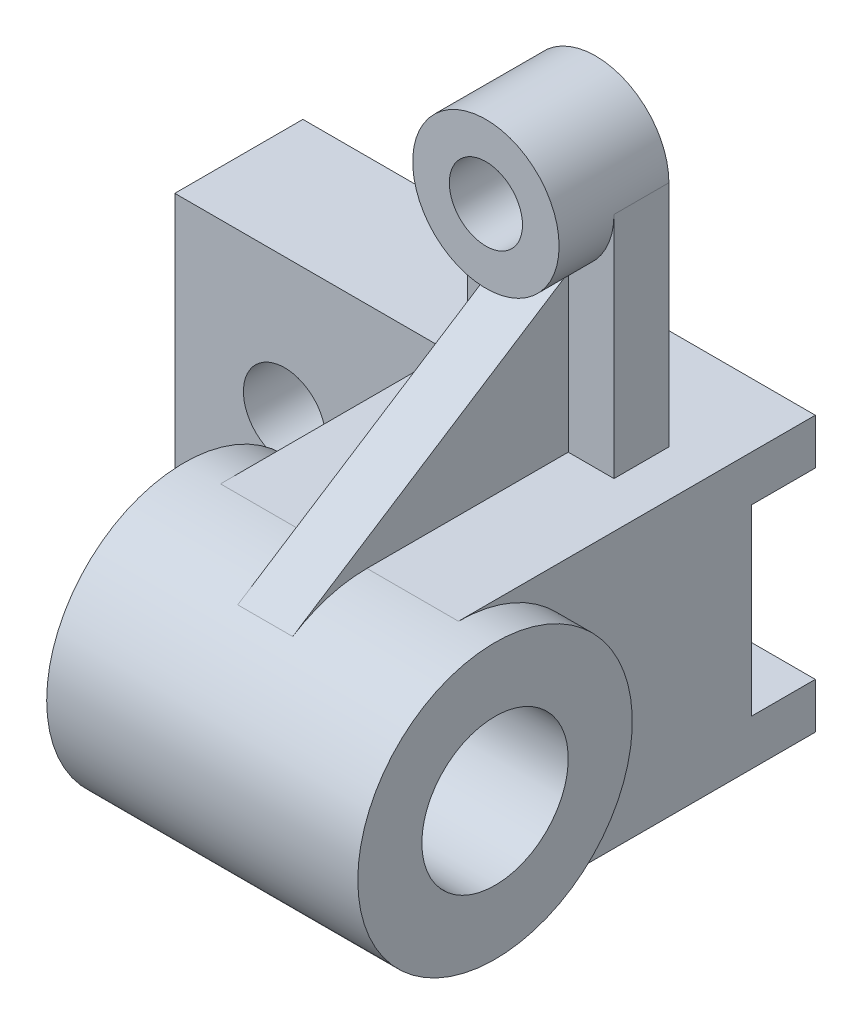
ISO-10303-21;
HEADER;
FILE_DESCRIPTION(('STEP AP214'),'2;1');
FILE_NAME('part.step','',(''),(''),'','','');
FILE_SCHEMA(('AUTOMOTIVE_DESIGN { 1 0 10303 214 1 1 1 1 }'));
ENDSEC;
DATA;
#1=APPLICATION_CONTEXT('core data for automotive mechanical design processes');
#2=APPLICATION_PROTOCOL_DEFINITION('international standard','automotive_design',2000,#1);
#3=PRODUCT_CONTEXT('',#1,'mechanical');
#4=PRODUCT('Part','Part','',(#3));
#5=PRODUCT_RELATED_PRODUCT_CATEGORY('part','',(#4));
#6=PRODUCT_DEFINITION_FORMATION('','',#4);
#7=PRODUCT_DEFINITION_CONTEXT('part definition',#1,'design');
#8=PRODUCT_DEFINITION('design','',#6,#7);
#9=PRODUCT_DEFINITION_SHAPE('','',#8);
#10=(LENGTH_UNIT() NAMED_UNIT(*) SI_UNIT(.MILLI.,.METRE.));
#11=(NAMED_UNIT(*) PLANE_ANGLE_UNIT() SI_UNIT($,.RADIAN.));
#12=(NAMED_UNIT(*) SI_UNIT($,.STERADIAN.) SOLID_ANGLE_UNIT());
#13=UNCERTAINTY_MEASURE_WITH_UNIT(LENGTH_MEASURE(1.E-05),#10,'distance_accuracy_value','');
#14=(GEOMETRIC_REPRESENTATION_CONTEXT(3) GLOBAL_UNCERTAINTY_ASSIGNED_CONTEXT((#13)) GLOBAL_UNIT_ASSIGNED_CONTEXT((#10,
#11,#12)) REPRESENTATION_CONTEXT('',''));
#15=CARTESIAN_POINT('',(0.,0.,0.));
#16=DIRECTION('',(0.,0.,1.));
#17=DIRECTION('',(1.,0.,0.));
#18=AXIS2_PLACEMENT_3D('',#15,#16,#17);
#19=CARTESIAN_POINT('',(46.,80.,6.));
#20=DIRECTION('',(0.,0.,-1.));
#21=DIRECTION('',(-1.,0.,0.));
#22=AXIS2_PLACEMENT_3D('',#19,#20,#21);
#23=PLANE('',#22);
#24=DIRECTION('',(1.,0.,0.));
#25=VECTOR('',#24,1.);
#26=CARTESIAN_POINT('',(46.,64.,6.));
#27=LINE('',#26,#25);
#28=CARTESIAN_POINT('',(30.,64.,6.));
#29=VERTEX_POINT('',#28);
#30=CARTESIAN_POINT('',(36.,64.,6.));
#31=VERTEX_POINT('',#30);
#32=EDGE_CURVE('E630',#29,#31,#27,.T.);
#33=ORIENTED_EDGE('',*,*,#32,.T.);
#34=DIRECTION('',(0.,-1.,0.));
#35=VECTOR('',#34,1.);
#36=CARTESIAN_POINT('',(36.,80.,6.));
#37=LINE('',#36,#35);
#38=CARTESIAN_POINT('',(36.,30.,6.));
#39=VERTEX_POINT('',#38);
#40=EDGE_CURVE('E200',#31,#39,#37,.T.);
#41=ORIENTED_EDGE('',*,*,#40,.T.);
#42=DIRECTION('',(1.,0.,0.));
#43=VECTOR('',#42,1.);
#44=CARTESIAN_POINT('',(46.,30.,6.));
#45=LINE('',#44,#43);
#46=CARTESIAN_POINT('',(46.,30.,6.));
#47=VERTEX_POINT('',#46);
#48=EDGE_CURVE('E179',#39,#47,#45,.T.);
#49=ORIENTED_EDGE('',*,*,#48,.T.);
#50=DIRECTION('',(0.,-1.,0.));
#51=VECTOR('',#50,1.);
#52=CARTESIAN_POINT('',(46.,80.,6.));
#53=LINE('',#52,#51);
#54=CARTESIAN_POINT('',(46.,80.,6.));
#55=VERTEX_POINT('',#54);
#56=EDGE_CURVE('E236',#55,#47,#53,.T.);
#57=ORIENTED_EDGE('',*,*,#56,.F.);
#58=CARTESIAN_POINT('',(30.,80.,6.));
#59=DIRECTION('',(0.,0.,-1.));
#60=DIRECTION('',(-1.,0.,0.));
#61=AXIS2_PLACEMENT_3D('',#58,#59,#60);
#62=CIRCLE('',#61,16.);
#63=EDGE_CURVE('E215',#29,#55,#62,.F.);
#64=ORIENTED_EDGE('',*,*,#63,.F.);
#65=EDGE_LOOP('',(#33,#41,#49,#57,#64));
#66=FACE_BOUND('',#65,.T.);
#67=ADVANCED_FACE('F39',(#66),#23,.F.);
#68=CARTESIAN_POINT('',(-56.,30.,-28.));
#69=DIRECTION('',(0.,1.,0.));
#70=DIRECTION('',(0.,0.,1.));
#71=AXIS2_PLACEMENT_3D('',#68,#69,#70);
#72=PLANE('',#71);
#73=DIRECTION('',(0.,0.,-1.));
#74=VECTOR('',#73,1.);
#75=CARTESIAN_POINT('',(36.,30.,-28.));
#76=LINE('',#75,#74);
#77=CARTESIAN_POINT('',(36.,30.,50.));
#78=VERTEX_POINT('',#77);
#79=EDGE_CURVE('E195',#78,#39,#76,.T.);
#80=ORIENTED_EDGE('',*,*,#79,.F.);
#81=DIRECTION('',(-1.,0.,0.));
#82=VECTOR('',#81,1.);
#83=CARTESIAN_POINT('',(56.,30.,50.));
#84=LINE('',#83,#82);
#85=CARTESIAN_POINT('',(56.,30.,50.));
#86=VERTEX_POINT('',#85);
#87=EDGE_CURVE('E259',#86,#78,#84,.T.);
#88=ORIENTED_EDGE('',*,*,#87,.F.);
#89=DIRECTION('',(0.,0.,1.));
#90=VECTOR('',#89,1.);
#91=CARTESIAN_POINT('',(56.,30.,-28.));
#92=LINE('',#91,#90);
#93=CARTESIAN_POINT('',(56.,30.,-28.));
#94=VERTEX_POINT('',#93);
#95=EDGE_CURVE('E310',#94,#86,#92,.T.);
#96=ORIENTED_EDGE('',*,*,#95,.F.);
#97=DIRECTION('',(-1.,0.,0.));
#98=VECTOR('',#97,1.);
#99=CARTESIAN_POINT('',(-56.,30.,-28.));
#100=LINE('',#99,#98);
#101=CARTESIAN_POINT('',(-56.,30.,-28.));
#102=VERTEX_POINT('',#101);
#103=EDGE_CURVE('E301',#94,#102,#100,.T.);
#104=ORIENTED_EDGE('',*,*,#103,.T.);
#105=DIRECTION('',(0.,0.,1.));
#106=VECTOR('',#105,1.);
#107=CARTESIAN_POINT('',(-56.,30.,-28.));
#108=LINE('',#107,#106);
#109=CARTESIAN_POINT('',(-56.,30.,0.));
#110=VERTEX_POINT('',#109);
#111=EDGE_CURVE('E318',#102,#110,#108,.T.);
#112=ORIENTED_EDGE('',*,*,#111,.T.);
#113=DIRECTION('',(-1.,0.,0.));
#114=VECTOR('',#113,1.);
#115=CARTESIAN_POINT('',(-56.,30.,0.));
#116=LINE('',#115,#114);
#117=CARTESIAN_POINT('',(4.00000000000002,30.,0.));
#118=VERTEX_POINT('',#117);
#119=EDGE_CURVE('E292',#118,#110,#116,.T.);
#120=ORIENTED_EDGE('',*,*,#119,.F.);
#121=DIRECTION('',(0.,0.,-1.));
#122=VECTOR('',#121,1.);
#123=CARTESIAN_POINT('',(4.00000000000002,30.,50.));
#124=LINE('',#123,#122);
#125=CARTESIAN_POINT('',(4.00000000000002,30.,50.));
#126=VERTEX_POINT('',#125);
#127=EDGE_CURVE('E268',#126,#118,#124,.T.);
#128=ORIENTED_EDGE('',*,*,#127,.F.);
#129=CARTESIAN_POINT('',(24.,30.,50.));
#130=VERTEX_POINT('',#129);
#131=EDGE_CURVE('E186',#130,#126,#84,.T.);
#132=ORIENTED_EDGE('',*,*,#131,.F.);
#133=DIRECTION('',(0.,0.,-1.));
#134=VECTOR('',#133,1.);
#135=CARTESIAN_POINT('',(24.,30.,-28.));
#136=LINE('',#135,#134);
#137=CARTESIAN_POINT('',(24.,30.,6.));
#138=VERTEX_POINT('',#137);
#139=EDGE_CURVE('E183',#130,#138,#136,.T.);
#140=ORIENTED_EDGE('',*,*,#139,.T.);
#141=CARTESIAN_POINT('',(14.,30.,6.));
#142=VERTEX_POINT('',#141);
#143=EDGE_CURVE('E167',#142,#138,#45,.T.);
#144=ORIENTED_EDGE('',*,*,#143,.F.);
#145=DIRECTION('',(0.,0.,1.));
#146=VECTOR('',#145,1.);
#147=CARTESIAN_POINT('',(14.,30.,-6.));
#148=LINE('',#147,#146);
#149=CARTESIAN_POINT('',(14.,30.,-6.));
#150=VERTEX_POINT('',#149);
#151=EDGE_CURVE('E219',#150,#142,#148,.T.);
#152=ORIENTED_EDGE('',*,*,#151,.F.);
#153=DIRECTION('',(-1.,0.,0.));
#154=VECTOR('',#153,1.);
#155=CARTESIAN_POINT('',(46.,30.,-6.));
#156=LINE('',#155,#154);
#157=CARTESIAN_POINT('',(46.,30.,-6.));
#158=VERTEX_POINT('',#157);
#159=EDGE_CURVE('E224',#158,#150,#156,.T.);
#160=ORIENTED_EDGE('',*,*,#159,.F.);
#161=DIRECTION('',(0.,0.,-1.));
#162=VECTOR('',#161,1.);
#163=CARTESIAN_POINT('',(46.,30.,-6.));
#164=LINE('',#163,#162);
#165=EDGE_CURVE('E178',#47,#158,#164,.T.);
#166=ORIENTED_EDGE('',*,*,#165,.F.);
#167=ORIENTED_EDGE('',*,*,#48,.F.);
#168=EDGE_LOOP('',(#80,#88,#96,#104,#112,#120,#128,#132,#140,#144,#152,#160,#166,#167));
#169=FACE_BOUND('',#168,.T.);
#170=ADVANCED_FACE('F184',(#169),#72,.T.);
#171=CARTESIAN_POINT('',(0.,0.,0.));
#172=DIRECTION('',(0.,0.,-1.));
#173=DIRECTION('',(-1.,0.,0.));
#174=AXIS2_PLACEMENT_3D('',#171,#172,#173);
#175=PLANE('',#174);
#176=CARTESIAN_POINT('',(-32.,0.,0.));
#177=DIRECTION('',(0.,0.,1.));
#178=DIRECTION('',(1.,0.,0.));
#179=AXIS2_PLACEMENT_3D('',#176,#177,#178);
#180=CIRCLE('',#179,9.);
#181=CARTESIAN_POINT('',(-23.,0.,0.));
#182=VERTEX_POINT('',#181);
#183=EDGE_CURVE('E622',#182,#182,#180,.T.);
#184=ORIENTED_EDGE('',*,*,#183,.F.);
#185=EDGE_LOOP('',(#184));
#186=FACE_BOUND('',#185,.T.);
#187=DIRECTION('',(0.,-1.,0.));
#188=VECTOR('',#187,1.);
#189=CARTESIAN_POINT('',(4.00000000000002,-30.,0.));
#190=LINE('',#189,#188);
#191=CARTESIAN_POINT('',(4.00000000000002,-30.,0.));
#192=VERTEX_POINT('',#191);
#193=EDGE_CURVE('E258',#118,#192,#190,.T.);
#194=ORIENTED_EDGE('',*,*,#193,.F.);
#195=ORIENTED_EDGE('',*,*,#119,.T.);
#196=DIRECTION('',(0.,-1.,0.));
#197=VECTOR('',#196,1.);
#198=CARTESIAN_POINT('',(-56.,-30.,0.));
#199=LINE('',#198,#197);
#200=CARTESIAN_POINT('',(-56.,-30.,0.));
#201=VERTEX_POINT('',#200);
#202=EDGE_CURVE('E312',#110,#201,#199,.T.);
#203=ORIENTED_EDGE('',*,*,#202,.T.);
#204=DIRECTION('',(1.,0.,0.));
#205=VECTOR('',#204,1.);
#206=CARTESIAN_POINT('',(-56.,-30.,0.));
#207=LINE('',#206,#205);
#208=EDGE_CURVE('E315',#201,#192,#207,.T.);
#209=ORIENTED_EDGE('',*,*,#208,.T.);
#210=EDGE_LOOP('',(#194,#195,#203,#209));
#211=FACE_BOUND('',#210,.T.);
#212=ADVANCED_FACE('F364',(#186,#211),#175,.F.);
#213=CARTESIAN_POINT('',(0.,0.,-28.));
#214=DIRECTION('',(0.,0.,-1.));
#215=DIRECTION('',(-1.,0.,0.));
#216=AXIS2_PLACEMENT_3D('',#213,#214,#215);
#217=PLANE('',#216);
#218=DIRECTION('',(0.,1.,0.));
#219=VECTOR('',#218,1.);
#220=CARTESIAN_POINT('',(56.,-30.,-28.));
#221=LINE('',#220,#219);
#222=CARTESIAN_POINT('',(56.,-30.,-28.));
#223=VERTEX_POINT('',#222);
#224=CARTESIAN_POINT('',(56.,-20.,-28.));
#225=VERTEX_POINT('',#224);
#226=EDGE_CURVE('E298',#223,#225,#221,.T.);
#227=ORIENTED_EDGE('',*,*,#226,.F.);
#228=DIRECTION('',(1.,0.,0.));
#229=VECTOR('',#228,1.);
#230=CARTESIAN_POINT('',(-56.,-30.,-28.));
#231=LINE('',#230,#229);
#232=CARTESIAN_POINT('',(-56.,-30.,-28.));
#233=VERTEX_POINT('',#232);
#234=EDGE_CURVE('E308',#233,#223,#231,.T.);
#235=ORIENTED_EDGE('',*,*,#234,.F.);
#236=DIRECTION('',(0.,-1.,0.));
#237=VECTOR('',#236,1.);
#238=CARTESIAN_POINT('',(-56.,-30.,-28.));
#239=LINE('',#238,#237);
#240=CARTESIAN_POINT('',(-56.,-20.,-28.));
#241=VERTEX_POINT('',#240);
#242=EDGE_CURVE('E304',#241,#233,#239,.T.);
#243=ORIENTED_EDGE('',*,*,#242,.F.);
#244=DIRECTION('',(1.,0.,0.));
#245=VECTOR('',#244,1.);
#246=CARTESIAN_POINT('',(-56.,-20.,-28.));
#247=LINE('',#246,#245);
#248=EDGE_CURVE('E290',#241,#225,#247,.T.);
#249=ORIENTED_EDGE('',*,*,#248,.T.);
#250=EDGE_LOOP('',(#227,#235,#243,#249));
#251=FACE_BOUND('',#250,.T.);
#252=ADVANCED_FACE('F341',(#251),#217,.T.);
#253=CARTESIAN_POINT('',(56.,-30.,-28.));
#254=DIRECTION('',(1.,0.,0.));
#255=DIRECTION('',(0.,0.,-1.));
#256=AXIS2_PLACEMENT_3D('',#253,#254,#255);
#257=PLANE('',#256);
#258=ORIENTED_EDGE('',*,*,#95,.T.);
#259=CARTESIAN_POINT('',(56.,0.,50.));
#260=DIRECTION('',(1.,0.,0.));
#261=DIRECTION('',(0.,0.,-1.));
#262=AXIS2_PLACEMENT_3D('',#259,#260,#261);
#263=CIRCLE('',#262,30.);
#264=CARTESIAN_POINT('',(56.,-30.,50.));
#265=VERTEX_POINT('',#264);
#266=EDGE_CURVE('E255',#86,#265,#263,.F.);
#267=ORIENTED_EDGE('',*,*,#266,.T.);
#268=DIRECTION('',(0.,0.,1.));
#269=VECTOR('',#268,1.);
#270=CARTESIAN_POINT('',(56.,-30.,-28.));
#271=LINE('',#270,#269);
#272=EDGE_CURVE('E11',#223,#265,#271,.T.);
#273=ORIENTED_EDGE('',*,*,#272,.F.);
#274=ORIENTED_EDGE('',*,*,#226,.T.);
#275=DIRECTION('',(0.,0.,-1.));
#276=VECTOR('',#275,1.);
#277=CARTESIAN_POINT('',(56.,-20.,-28.));
#278=LINE('',#277,#276);
#279=CARTESIAN_POINT('',(56.,-20.,-14.));
#280=VERTEX_POINT('',#279);
#281=EDGE_CURVE('E276',#280,#225,#278,.T.);
#282=ORIENTED_EDGE('',*,*,#281,.F.);
#283=DIRECTION('',(0.,-1.,0.));
#284=VECTOR('',#283,1.);
#285=CARTESIAN_POINT('',(56.,-20.,-14.));
#286=LINE('',#285,#284);
#287=CARTESIAN_POINT('',(56.,20.,-14.));
#288=VERTEX_POINT('',#287);
#289=EDGE_CURVE('E285',#288,#280,#286,.T.);
#290=ORIENTED_EDGE('',*,*,#289,.F.);
#291=DIRECTION('',(0.,0.,1.));
#292=VECTOR('',#291,1.);
#293=CARTESIAN_POINT('',(56.,20.,-28.));
#294=LINE('',#293,#292);
#295=CARTESIAN_POINT('',(56.,20.,-28.));
#296=VERTEX_POINT('',#295);
#297=EDGE_CURVE('E271',#296,#288,#294,.T.);
#298=ORIENTED_EDGE('',*,*,#297,.F.);
#299=EDGE_CURVE('E302',#296,#94,#221,.T.);
#300=ORIENTED_EDGE('',*,*,#299,.T.);
#301=EDGE_LOOP('',(#258,#267,#273,#274,#282,#290,#298,#300));
#302=FACE_BOUND('',#301,.T.);
#303=ADVANCED_FACE('F41',(#302),#257,.T.);
#304=CARTESIAN_POINT('',(-56.,-30.,-28.));
#305=DIRECTION('',(0.,-1.,0.));
#306=DIRECTION('',(0.,0.,-1.));
#307=AXIS2_PLACEMENT_3D('',#304,#305,#306);
#308=PLANE('',#307);
#309=ORIENTED_EDGE('',*,*,#272,.T.);
#310=DIRECTION('',(1.,0.,0.));
#311=VECTOR('',#310,1.);
#312=CARTESIAN_POINT('',(56.,-30.,50.));
#313=LINE('',#312,#311);
#314=CARTESIAN_POINT('',(4.00000000000002,-30.,50.));
#315=VERTEX_POINT('',#314);
#316=EDGE_CURVE('E261',#315,#265,#313,.T.);
#317=ORIENTED_EDGE('',*,*,#316,.F.);
#318=DIRECTION('',(0.,0.,-1.));
#319=VECTOR('',#318,1.);
#320=CARTESIAN_POINT('',(4.00000000000002,-30.,50.));
#321=LINE('',#320,#319);
#322=EDGE_CURVE('E263',#315,#192,#321,.T.);
#323=ORIENTED_EDGE('',*,*,#322,.T.);
#324=ORIENTED_EDGE('',*,*,#208,.F.);
#325=DIRECTION('',(0.,0.,1.));
#326=VECTOR('',#325,1.);
#327=CARTESIAN_POINT('',(-56.,-30.,-28.));
#328=LINE('',#327,#326);
#329=EDGE_CURVE('E48',#233,#201,#328,.T.);
#330=ORIENTED_EDGE('',*,*,#329,.F.);
#331=ORIENTED_EDGE('',*,*,#234,.T.);
#332=EDGE_LOOP('',(#309,#317,#323,#324,#330,#331));
#333=FACE_BOUND('',#332,.T.);
#334=ADVANCED_FACE('F334',(#333),#308,.T.);
#335=CARTESIAN_POINT('',(-56.,-30.,-28.));
#336=DIRECTION('',(-1.,0.,0.));
#337=DIRECTION('',(0.,0.,1.));
#338=AXIS2_PLACEMENT_3D('',#335,#336,#337);
#339=PLANE('',#338);
#340=DIRECTION('',(0.,0.,-1.));
#341=VECTOR('',#340,1.);
#342=CARTESIAN_POINT('',(-56.,-20.,-28.));
#343=LINE('',#342,#341);
#344=CARTESIAN_POINT('',(-56.,-20.,-14.));
#345=VERTEX_POINT('',#344);
#346=EDGE_CURVE('E279',#345,#241,#343,.T.);
#347=ORIENTED_EDGE('',*,*,#346,.T.);
#348=ORIENTED_EDGE('',*,*,#242,.T.);
#349=ORIENTED_EDGE('',*,*,#329,.T.);
#350=ORIENTED_EDGE('',*,*,#202,.F.);
#351=ORIENTED_EDGE('',*,*,#111,.F.);
#352=CARTESIAN_POINT('',(-56.,20.,-28.));
#353=VERTEX_POINT('',#352);
#354=EDGE_CURVE('E305',#102,#353,#239,.T.);
#355=ORIENTED_EDGE('',*,*,#354,.T.);
#356=DIRECTION('',(0.,0.,1.));
#357=VECTOR('',#356,1.);
#358=CARTESIAN_POINT('',(-56.,20.,-28.));
#359=LINE('',#358,#357);
#360=CARTESIAN_POINT('',(-56.,20.,-14.));
#361=VERTEX_POINT('',#360);
#362=EDGE_CURVE('E272',#353,#361,#359,.T.);
#363=ORIENTED_EDGE('',*,*,#362,.T.);
#364=DIRECTION('',(0.,-1.,0.));
#365=VECTOR('',#364,1.);
#366=CARTESIAN_POINT('',(-56.,-20.,-14.));
#367=LINE('',#366,#365);
#368=EDGE_CURVE('E275',#361,#345,#367,.T.);
#369=ORIENTED_EDGE('',*,*,#368,.T.);
#370=EDGE_LOOP('',(#347,#348,#349,#350,#351,#355,#363,#369));
#371=FACE_BOUND('',#370,.T.);
#372=ADVANCED_FACE('F358',(#371),#339,.T.);
#373=ORIENTED_EDGE('',*,*,#299,.F.);
#374=DIRECTION('',(1.,0.,0.));
#375=VECTOR('',#374,1.);
#376=CARTESIAN_POINT('',(-56.,20.,-28.));
#377=LINE('',#376,#375);
#378=EDGE_CURVE('E282',#353,#296,#377,.T.);
#379=ORIENTED_EDGE('',*,*,#378,.F.);
#380=ORIENTED_EDGE('',*,*,#354,.F.);
#381=ORIENTED_EDGE('',*,*,#103,.F.);
#382=EDGE_LOOP('',(#373,#379,#380,#381));
#383=FACE_BOUND('',#382,.T.);
#384=ADVANCED_FACE('F355',(#383),#217,.T.);
#385=CARTESIAN_POINT('',(-56.,-20.,-28.));
#386=DIRECTION('',(0.,-1.,0.));
#387=DIRECTION('',(0.,0.,-1.));
#388=AXIS2_PLACEMENT_3D('',#385,#386,#387);
#389=PLANE('',#388);
#390=ORIENTED_EDGE('',*,*,#281,.T.);
#391=ORIENTED_EDGE('',*,*,#248,.F.);
#392=ORIENTED_EDGE('',*,*,#346,.F.);
#393=DIRECTION('',(1.,0.,0.));
#394=VECTOR('',#393,1.);
#395=CARTESIAN_POINT('',(-56.,-20.,-14.));
#396=LINE('',#395,#394);
#397=EDGE_CURVE('E293',#345,#280,#396,.T.);
#398=ORIENTED_EDGE('',*,*,#397,.T.);
#399=EDGE_LOOP('',(#390,#391,#392,#398));
#400=FACE_BOUND('',#399,.T.);
#401=ADVANCED_FACE('F345',(#400),#389,.F.);
#402=CARTESIAN_POINT('',(-56.,-20.,-14.));
#403=DIRECTION('',(0.,0.,1.));
#404=DIRECTION('',(0.,-1.,0.));
#405=AXIS2_PLACEMENT_3D('',#402,#403,#404);
#406=PLANE('',#405);
#407=CARTESIAN_POINT('',(-32.,0.,-14.));
#408=DIRECTION('',(0.,0.,1.));
#409=DIRECTION('',(0.,-1.,0.));
#410=AXIS2_PLACEMENT_3D('',#407,#408,#409);
#411=CIRCLE('',#410,9.);
#412=CARTESIAN_POINT('',(-32.,-9.,-14.));
#413=VERTEX_POINT('',#412);
#414=EDGE_CURVE('E43',#413,#413,#411,.T.);
#415=ORIENTED_EDGE('',*,*,#414,.T.);
#416=EDGE_LOOP('',(#415));
#417=FACE_BOUND('',#416,.T.);
#418=ORIENTED_EDGE('',*,*,#289,.T.);
#419=ORIENTED_EDGE('',*,*,#397,.F.);
#420=ORIENTED_EDGE('',*,*,#368,.F.);
#421=DIRECTION('',(1.,0.,0.));
#422=VECTOR('',#421,1.);
#423=CARTESIAN_POINT('',(-56.,20.,-14.));
#424=LINE('',#423,#422);
#425=EDGE_CURVE('E295',#361,#288,#424,.T.);
#426=ORIENTED_EDGE('',*,*,#425,.T.);
#427=EDGE_LOOP('',(#418,#419,#420,#426));
#428=FACE_BOUND('',#427,.T.);
#429=ADVANCED_FACE('F348',(#417,#428),#406,.F.);
#430=CARTESIAN_POINT('',(-56.,20.,-28.));
#431=DIRECTION('',(0.,1.,0.));
#432=DIRECTION('',(0.,0.,1.));
#433=AXIS2_PLACEMENT_3D('',#430,#431,#432);
#434=PLANE('',#433);
#435=ORIENTED_EDGE('',*,*,#297,.T.);
#436=ORIENTED_EDGE('',*,*,#425,.F.);
#437=ORIENTED_EDGE('',*,*,#362,.F.);
#438=ORIENTED_EDGE('',*,*,#378,.T.);
#439=EDGE_LOOP('',(#435,#436,#437,#438));
#440=FACE_BOUND('',#439,.T.);
#441=ADVANCED_FACE('F351',(#440),#434,.F.);
#442=CARTESIAN_POINT('',(4.00000000000002,-30.,50.));
#443=DIRECTION('',(1.,0.,0.));
#444=DIRECTION('',(0.,0.,-1.));
#445=AXIS2_PLACEMENT_3D('',#442,#443,#444);
#446=PLANE('',#445);
#447=CARTESIAN_POINT('',(4.00000000000002,0.,50.));
#448=DIRECTION('',(1.,0.,0.));
#449=DIRECTION('',(0.,0.,-1.));
#450=AXIS2_PLACEMENT_3D('',#447,#448,#449);
#451=CIRCLE('',#450,30.);
#452=EDGE_CURVE('E252',#126,#315,#451,.F.);
#453=ORIENTED_EDGE('',*,*,#452,.F.);
#454=ORIENTED_EDGE('',*,*,#127,.T.);
#455=ORIENTED_EDGE('',*,*,#193,.T.);
#456=ORIENTED_EDGE('',*,*,#322,.F.);
#457=EDGE_LOOP('',(#453,#454,#455,#456));
#458=FACE_BOUND('',#457,.T.);
#459=ADVANCED_FACE('F363',(#458),#446,.F.);
#460=CARTESIAN_POINT('',(-3.99999999999998,0.,50.));
#461=DIRECTION('',(-1.,0.,0.));
#462=DIRECTION('',(0.,0.,1.));
#463=AXIS2_PLACEMENT_3D('',#460,#461,#462);
#464=PLANE('',#463);
#465=CARTESIAN_POINT('',(-3.99999999999998,0.,50.));
#466=DIRECTION('',(-1.,0.,0.));
#467=DIRECTION('',(0.,0.,1.));
#468=AXIS2_PLACEMENT_3D('',#465,#466,#467);
#469=CIRCLE('',#468,30.);
#470=CARTESIAN_POINT('',(-3.99999999999998,0.,80.));
#471=VERTEX_POINT('',#470);
#472=EDGE_CURVE('E249',#471,#471,#469,.T.);
#473=ORIENTED_EDGE('',*,*,#472,.T.);
#474=EDGE_LOOP('',(#473));
#475=FACE_BOUND('',#474,.T.);
#476=CARTESIAN_POINT('',(-3.99999999999998,0.,50.));
#477=DIRECTION('',(-1.,0.,0.));
#478=DIRECTION('',(0.,0.,1.));
#479=AXIS2_PLACEMENT_3D('',#476,#477,#478);
#480=CIRCLE('',#479,16.);
#481=CARTESIAN_POINT('',(-3.99999999999998,0.,66.));
#482=VERTEX_POINT('',#481);
#483=EDGE_CURVE('E246',#482,#482,#480,.T.);
#484=ORIENTED_EDGE('',*,*,#483,.F.);
#485=EDGE_LOOP('',(#484));
#486=FACE_BOUND('',#485,.T.);
#487=ADVANCED_FACE('F407',(#475,#486),#464,.T.);
#488=CARTESIAN_POINT('',(-3.99999999999998,0.,50.));
#489=DIRECTION('',(1.,0.,0.));
#490=DIRECTION('',(0.,0.,-1.));
#491=AXIS2_PLACEMENT_3D('',#488,#489,#490);
#492=CYLINDRICAL_SURFACE('',#491,30.);
#493=CARTESIAN_POINT('',(36.,0.,50.));
#494=DIRECTION('',(1.,0.,0.));
#495=DIRECTION('',(0.,0.,-1.));
#496=AXIS2_PLACEMENT_3D('',#493,#494,#495);
#497=CIRCLE('',#496,30.);
#498=CARTESIAN_POINT('',(36.,25.2258176319068,66.2375529191372));
#499=VERTEX_POINT('',#498);
#500=EDGE_CURVE('E56',#78,#499,#497,.T.);
#501=ORIENTED_EDGE('',*,*,#500,.T.);
#502=DIRECTION('',(1.,0.,0.));
#503=VECTOR('',#502,1.);
#504=CARTESIAN_POINT('',(-3.99999999999998,25.2258176319068,66.2375529191372));
#505=LINE('',#504,#503);
#506=CARTESIAN_POINT('',(24.,25.2258176319068,66.2375529191372));
#507=VERTEX_POINT('',#506);
#508=EDGE_CURVE('E60',#507,#499,#505,.T.);
#509=ORIENTED_EDGE('',*,*,#508,.F.);
#510=CARTESIAN_POINT('',(24.,0.,50.));
#511=DIRECTION('',(1.,0.,0.));
#512=DIRECTION('',(0.,0.,-1.));
#513=AXIS2_PLACEMENT_3D('',#510,#511,#512);
#514=CIRCLE('',#513,30.);
#515=EDGE_CURVE('E188',#130,#507,#514,.T.);
#516=ORIENTED_EDGE('',*,*,#515,.F.);
#517=ORIENTED_EDGE('',*,*,#131,.T.);
#518=ORIENTED_EDGE('',*,*,#452,.T.);
#519=ORIENTED_EDGE('',*,*,#316,.T.);
#520=ORIENTED_EDGE('',*,*,#266,.F.);
#521=ORIENTED_EDGE('',*,*,#87,.T.);
#522=EDGE_LOOP('',(#501,#509,#516,#517,#518,#519,#520,#521));
#523=FACE_BOUND('',#522,.T.);
#524=CARTESIAN_POINT('',(64.,0.,50.));
#525=DIRECTION('',(-1.,0.,0.));
#526=DIRECTION('',(0.,0.,1.));
#527=AXIS2_PLACEMENT_3D('',#524,#525,#526);
#528=CIRCLE('',#527,30.);
#529=CARTESIAN_POINT('',(64.,0.,80.));
#530=VERTEX_POINT('',#529);
#531=EDGE_CURVE('E243',#530,#530,#528,.T.);
#532=ORIENTED_EDGE('',*,*,#531,.T.);
#533=EDGE_LOOP('',(#532));
#534=FACE_BOUND('',#533,.T.);
#535=ORIENTED_EDGE('',*,*,#472,.F.);
#536=EDGE_LOOP('',(#535));
#537=FACE_BOUND('',#536,.T.);
#538=ADVANCED_FACE('F329',(#523,#534,#537),#492,.T.);
#539=CARTESIAN_POINT('',(-3.99999999999998,0.,50.));
#540=DIRECTION('',(1.,0.,0.));
#541=DIRECTION('',(0.,0.,-1.));
#542=AXIS2_PLACEMENT_3D('',#539,#540,#541);
#543=CYLINDRICAL_SURFACE('',#542,16.);
#544=CARTESIAN_POINT('',(64.,0.,50.));
#545=DIRECTION('',(-1.,0.,0.));
#546=DIRECTION('',(0.,0.,1.));
#547=AXIS2_PLACEMENT_3D('',#544,#545,#546);
#548=CIRCLE('',#547,16.);
#549=CARTESIAN_POINT('',(64.,0.,66.));
#550=VERTEX_POINT('',#549);
#551=EDGE_CURVE('E240',#550,#550,#548,.T.);
#552=ORIENTED_EDGE('',*,*,#551,.F.);
#553=EDGE_LOOP('',(#552));
#554=FACE_BOUND('',#553,.T.);
#555=ORIENTED_EDGE('',*,*,#483,.T.);
#556=EDGE_LOOP('',(#555));
#557=FACE_BOUND('',#556,.T.);
#558=ADVANCED_FACE('F401',(#554,#557),#543,.F.);
#559=CARTESIAN_POINT('',(64.,0.,50.));
#560=DIRECTION('',(-1.,0.,0.));
#561=DIRECTION('',(0.,0.,1.));
#562=AXIS2_PLACEMENT_3D('',#559,#560,#561);
#563=PLANE('',#562);
#564=ORIENTED_EDGE('',*,*,#551,.T.);
#565=EDGE_LOOP('',(#564));
#566=FACE_BOUND('',#565,.T.);
#567=ORIENTED_EDGE('',*,*,#531,.F.);
#568=EDGE_LOOP('',(#567));
#569=FACE_BOUND('',#568,.T.);
#570=ADVANCED_FACE('F396',(#566,#569),#563,.F.);
#571=CARTESIAN_POINT('',(14.,80.,-6.));
#572=DIRECTION('',(1.,0.,0.));
#573=DIRECTION('',(0.,0.,-1.));
#574=AXIS2_PLACEMENT_3D('',#571,#572,#573);
#575=PLANE('',#574);
#576=ORIENTED_EDGE('',*,*,#151,.T.);
#577=DIRECTION('',(0.,-1.,0.));
#578=VECTOR('',#577,1.);
#579=CARTESIAN_POINT('',(14.,80.,6.));
#580=LINE('',#579,#578);
#581=CARTESIAN_POINT('',(14.,80.,6.));
#582=VERTEX_POINT('',#581);
#583=EDGE_CURVE('E174',#582,#142,#580,.T.);
#584=ORIENTED_EDGE('',*,*,#583,.F.);
#585=DIRECTION('',(0.,0.,1.));
#586=VECTOR('',#585,1.);
#587=CARTESIAN_POINT('',(14.,80.,-6.));
#588=LINE('',#587,#586);
#589=CARTESIAN_POINT('',(14.,80.,-5.99999999999999));
#590=VERTEX_POINT('',#589);
#591=EDGE_CURVE('E220',#590,#582,#588,.T.);
#592=ORIENTED_EDGE('',*,*,#591,.F.);
#593=DIRECTION('',(0.,-1.,0.));
#594=VECTOR('',#593,1.);
#595=CARTESIAN_POINT('',(14.,80.,-6.));
#596=LINE('',#595,#594);
#597=EDGE_CURVE('E227',#590,#150,#596,.T.);
#598=ORIENTED_EDGE('',*,*,#597,.T.);
#599=EDGE_LOOP('',(#576,#584,#592,#598));
#600=FACE_BOUND('',#599,.T.);
#601=ADVANCED_FACE('F387',(#600),#575,.F.);
#602=DIRECTION('',(0.,-1.,0.));
#603=VECTOR('',#602,1.);
#604=CARTESIAN_POINT('',(24.,80.,6.));
#605=LINE('',#604,#603);
#606=CARTESIAN_POINT('',(24.,64.,6.));
#607=VERTEX_POINT('',#606);
#608=EDGE_CURVE('E171',#607,#138,#605,.T.);
#609=ORIENTED_EDGE('',*,*,#608,.F.);
#610=EDGE_CURVE('E633',#607,#29,#27,.T.);
#611=ORIENTED_EDGE('',*,*,#610,.T.);
#612=EDGE_CURVE('E216',#582,#29,#62,.F.);
#613=ORIENTED_EDGE('',*,*,#612,.F.);
#614=ORIENTED_EDGE('',*,*,#583,.T.);
#615=ORIENTED_EDGE('',*,*,#143,.T.);
#616=EDGE_LOOP('',(#609,#611,#613,#614,#615));
#617=FACE_BOUND('',#616,.T.);
#618=ADVANCED_FACE('F169',(#617),#23,.F.);
#619=CARTESIAN_POINT('',(46.,80.,-6.));
#620=DIRECTION('',(-1.,0.,0.));
#621=DIRECTION('',(0.,0.,1.));
#622=AXIS2_PLACEMENT_3D('',#619,#620,#621);
#623=PLANE('',#622);
#624=ORIENTED_EDGE('',*,*,#165,.T.);
#625=DIRECTION('',(0.,-1.,0.));
#626=VECTOR('',#625,1.);
#627=CARTESIAN_POINT('',(46.,80.,-6.));
#628=LINE('',#627,#626);
#629=CARTESIAN_POINT('',(46.,80.,-6.));
#630=VERTEX_POINT('',#629);
#631=EDGE_CURVE('E234',#630,#158,#628,.T.);
#632=ORIENTED_EDGE('',*,*,#631,.F.);
#633=DIRECTION('',(0.,0.,-1.));
#634=VECTOR('',#633,1.);
#635=CARTESIAN_POINT('',(46.,80.,-6.));
#636=LINE('',#635,#634);
#637=EDGE_CURVE('E223',#55,#630,#636,.T.);
#638=ORIENTED_EDGE('',*,*,#637,.F.);
#639=ORIENTED_EDGE('',*,*,#56,.T.);
#640=EDGE_LOOP('',(#624,#632,#638,#639));
#641=FACE_BOUND('',#640,.T.);
#642=ADVANCED_FACE('F386',(#641),#623,.F.);
#643=CARTESIAN_POINT('',(46.,80.,-6.));
#644=DIRECTION('',(0.,0.,1.));
#645=DIRECTION('',(1.,0.,0.));
#646=AXIS2_PLACEMENT_3D('',#643,#644,#645);
#647=PLANE('',#646);
#648=ORIENTED_EDGE('',*,*,#159,.T.);
#649=ORIENTED_EDGE('',*,*,#597,.F.);
#650=CARTESIAN_POINT('',(30.,80.,-5.99999999999999));
#651=DIRECTION('',(0.,0.,1.));
#652=DIRECTION('',(1.,0.,0.));
#653=AXIS2_PLACEMENT_3D('',#650,#651,#652);
#654=CIRCLE('',#653,16.);
#655=EDGE_CURVE('E206',#630,#590,#654,.T.);
#656=ORIENTED_EDGE('',*,*,#655,.F.);
#657=ORIENTED_EDGE('',*,*,#631,.T.);
#658=EDGE_LOOP('',(#648,#649,#656,#657));
#659=FACE_BOUND('',#658,.T.);
#660=CARTESIAN_POINT('',(30.,80.,-5.99999999999999));
#661=DIRECTION('',(0.,0.,1.));
#662=DIRECTION('',(1.,0.,0.));
#663=AXIS2_PLACEMENT_3D('',#660,#661,#662);
#664=CIRCLE('',#663,8.);
#665=CARTESIAN_POINT('',(38.,80.,-5.99999999999999));
#666=VERTEX_POINT('',#665);
#667=EDGE_CURVE('E203',#666,#666,#664,.T.);
#668=ORIENTED_EDGE('',*,*,#667,.T.);
#669=EDGE_LOOP('',(#668));
#670=FACE_BOUND('',#669,.T.);
#671=ADVANCED_FACE('F393',(#659,#670),#647,.F.);
#672=CARTESIAN_POINT('',(30.,80.,18.));
#673=DIRECTION('',(0.,0.,-1.));
#674=DIRECTION('',(-1.,0.,0.));
#675=AXIS2_PLACEMENT_3D('',#672,#673,#674);
#676=CYLINDRICAL_SURFACE('',#675,16.);
#677=CARTESIAN_POINT('',(30.,80.,18.));
#678=DIRECTION('',(0.,0.,1.));
#679=DIRECTION('',(1.,0.,0.));
#680=AXIS2_PLACEMENT_3D('',#677,#678,#679);
#681=CIRCLE('',#680,16.);
#682=CARTESIAN_POINT('',(46.,80.,18.));
#683=VERTEX_POINT('',#682);
#684=EDGE_CURVE('E212',#683,#683,#681,.T.);
#685=ORIENTED_EDGE('',*,*,#684,.F.);
#686=EDGE_LOOP('',(#685));
#687=FACE_BOUND('',#686,.T.);
#688=ORIENTED_EDGE('',*,*,#655,.T.);
#689=ORIENTED_EDGE('',*,*,#591,.T.);
#690=ORIENTED_EDGE('',*,*,#612,.T.);
#691=ORIENTED_EDGE('',*,*,#63,.T.);
#692=ORIENTED_EDGE('',*,*,#637,.T.);
#693=EDGE_LOOP('',(#688,#689,#690,#691,#692));
#694=FACE_BOUND('',#693,.T.);
#695=ADVANCED_FACE('F490',(#687,#694),#676,.T.);
#696=CARTESIAN_POINT('',(30.,80.,18.));
#697=DIRECTION('',(0.,0.,-1.));
#698=DIRECTION('',(-1.,0.,0.));
#699=AXIS2_PLACEMENT_3D('',#696,#697,#698);
#700=CYLINDRICAL_SURFACE('',#699,8.);
#701=ORIENTED_EDGE('',*,*,#667,.F.);
#702=EDGE_LOOP('',(#701));
#703=FACE_BOUND('',#702,.T.);
#704=CARTESIAN_POINT('',(30.,80.,18.));
#705=DIRECTION('',(0.,0.,1.));
#706=DIRECTION('',(1.,0.,0.));
#707=AXIS2_PLACEMENT_3D('',#704,#705,#706);
#708=CIRCLE('',#707,8.);
#709=CARTESIAN_POINT('',(38.,80.,18.));
#710=VERTEX_POINT('',#709);
#711=EDGE_CURVE('E209',#710,#710,#708,.T.);
#712=ORIENTED_EDGE('',*,*,#711,.T.);
#713=EDGE_LOOP('',(#712));
#714=FACE_BOUND('',#713,.T.);
#715=ADVANCED_FACE('F503',(#703,#714),#700,.F.);
#716=CARTESIAN_POINT('',(30.,80.,18.));
#717=DIRECTION('',(0.,0.,1.));
#718=DIRECTION('',(1.,0.,0.));
#719=AXIS2_PLACEMENT_3D('',#716,#717,#718);
#720=PLANE('',#719);
#721=ORIENTED_EDGE('',*,*,#684,.T.);
#722=EDGE_LOOP('',(#721));
#723=FACE_BOUND('',#722,.T.);
#724=ORIENTED_EDGE('',*,*,#711,.F.);
#725=EDGE_LOOP('',(#724));
#726=FACE_BOUND('',#725,.T.);
#727=ADVANCED_FACE('F514',(#723,#726),#720,.T.);
#728=CARTESIAN_POINT('',(36.,33.,26.));
#729=DIRECTION('',(1.,0.,0.));
#730=DIRECTION('',(0.,0.,-1.));
#731=AXIS2_PLACEMENT_3D('',#728,#729,#730);
#732=PLANE('',#731);
#733=ORIENTED_EDGE('',*,*,#40,.F.);
#734=DIRECTION('',(0.,-0.541251763971239,0.840860587730227));
#735=VECTOR('',#734,1.);
#736=CARTESIAN_POINT('',(36.,64.,6.));
#737=LINE('',#736,#735);
#738=EDGE_CURVE('E625',#31,#499,#737,.T.);
#739=ORIENTED_EDGE('',*,*,#738,.T.);
#740=ORIENTED_EDGE('',*,*,#500,.F.);
#741=ORIENTED_EDGE('',*,*,#79,.T.);
#742=EDGE_LOOP('',(#733,#739,#740,#741));
#743=FACE_BOUND('',#742,.T.);
#744=ADVANCED_FACE('F524',(#743),#732,.T.);
#745=CARTESIAN_POINT('',(24.,33.,26.));
#746=DIRECTION('',(1.,0.,0.));
#747=DIRECTION('',(0.,0.,-1.));
#748=AXIS2_PLACEMENT_3D('',#745,#746,#747);
#749=PLANE('',#748);
#750=DIRECTION('',(0.,-0.541251763971239,0.840860587730227));
#751=VECTOR('',#750,1.);
#752=CARTESIAN_POINT('',(24.,64.,6.));
#753=LINE('',#752,#751);
#754=EDGE_CURVE('E193',#607,#507,#753,.T.);
#755=ORIENTED_EDGE('',*,*,#754,.F.);
#756=ORIENTED_EDGE('',*,*,#608,.T.);
#757=ORIENTED_EDGE('',*,*,#139,.F.);
#758=ORIENTED_EDGE('',*,*,#515,.T.);
#759=EDGE_LOOP('',(#755,#756,#757,#758));
#760=FACE_BOUND('',#759,.T.);
#761=ADVANCED_FACE('F191',(#760),#749,.F.);
#762=CARTESIAN_POINT('',(30.,64.,6.));
#763=DIRECTION('',(0.,0.840860587730227,0.541251763971239));
#764=DIRECTION('',(0.,-0.541251763971239,0.840860587730227));
#765=AXIS2_PLACEMENT_3D('',#762,#763,#764);
#766=PLANE('',#765);
#767=ORIENTED_EDGE('',*,*,#754,.T.);
#768=ORIENTED_EDGE('',*,*,#508,.T.);
#769=ORIENTED_EDGE('',*,*,#738,.F.);
#770=ORIENTED_EDGE('',*,*,#32,.F.);
#771=ORIENTED_EDGE('',*,*,#610,.F.);
#772=EDGE_LOOP('',(#767,#768,#769,#770,#771));
#773=FACE_BOUND('',#772,.T.);
#774=ADVANCED_FACE('F545',(#773),#766,.T.);
#775=CARTESIAN_POINT('',(-32.,0.,-28.));
#776=DIRECTION('',(0.,0.,1.));
#777=DIRECTION('',(1.,0.,0.));
#778=AXIS2_PLACEMENT_3D('',#775,#776,#777);
#779=CYLINDRICAL_SURFACE('',#778,9.);
#780=ORIENTED_EDGE('',*,*,#183,.T.);
#781=EDGE_LOOP('',(#780));
#782=FACE_BOUND('',#781,.T.);
#783=ORIENTED_EDGE('',*,*,#414,.F.);
#784=EDGE_LOOP('',(#783));
#785=FACE_BOUND('',#784,.T.);
#786=ADVANCED_FACE('F552',(#782,#785),#779,.F.);
#787=CLOSED_SHELL('',(#67,#170,#212,#252,#303,#334,#372,#384,#401,#429,#441,#459,#487,#538,#558,
#570,#601,#618,#642,#671,#695,#715,#727,#744,#761,#774,#786));
#788=MANIFOLD_SOLID_BREP('B2',#787);
#789=ADVANCED_BREP_SHAPE_REPRESENTATION('',(#18,#788),#14);
#790=SHAPE_DEFINITION_REPRESENTATION(#9,#789);
ENDSEC;
END-ISO-10303-21;
